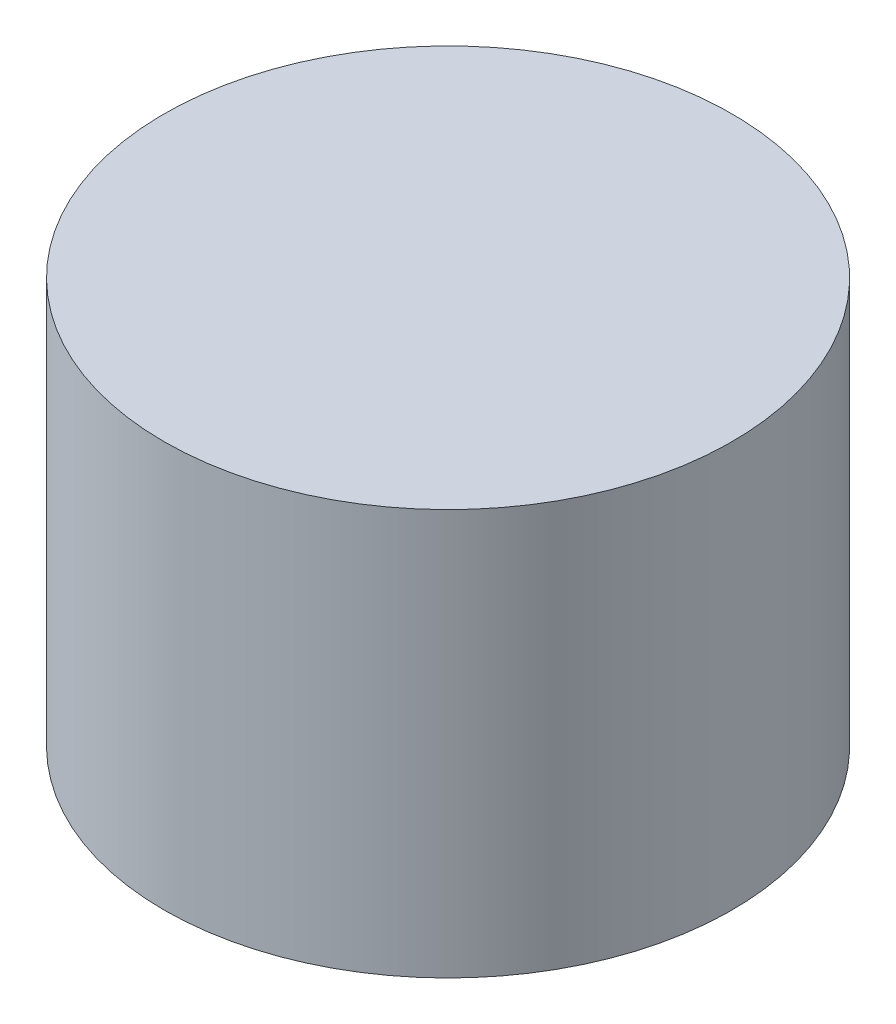
ISO-10303-21;
HEADER;
FILE_DESCRIPTION(('STEP AP214'),'2;1');
FILE_NAME('part.step','',(''),(''),'','','');
FILE_SCHEMA(('AUTOMOTIVE_DESIGN { 1 0 10303 214 1 1 1 1 }'));
ENDSEC;
DATA;
#1=APPLICATION_CONTEXT('core data for automotive mechanical design processes');
#2=APPLICATION_PROTOCOL_DEFINITION('international standard','automotive_design',2000,#1);
#3=PRODUCT_CONTEXT('',#1,'mechanical');
#4=PRODUCT('Part','Part','',(#3));
#5=PRODUCT_RELATED_PRODUCT_CATEGORY('part','',(#4));
#6=PRODUCT_DEFINITION_FORMATION('','',#4);
#7=PRODUCT_DEFINITION_CONTEXT('part definition',#1,'design');
#8=PRODUCT_DEFINITION('design','',#6,#7);
#9=PRODUCT_DEFINITION_SHAPE('','',#8);
#10=(LENGTH_UNIT() NAMED_UNIT(*) SI_UNIT(.MILLI.,.METRE.));
#11=(NAMED_UNIT(*) PLANE_ANGLE_UNIT() SI_UNIT($,.RADIAN.));
#12=(NAMED_UNIT(*) SI_UNIT($,.STERADIAN.) SOLID_ANGLE_UNIT());
#13=UNCERTAINTY_MEASURE_WITH_UNIT(LENGTH_MEASURE(1.E-05),#10,'distance_accuracy_value','');
#14=(GEOMETRIC_REPRESENTATION_CONTEXT(3) GLOBAL_UNCERTAINTY_ASSIGNED_CONTEXT((#13)) GLOBAL_UNIT_ASSIGNED_CONTEXT((#10,
#11,#12)) REPRESENTATION_CONTEXT('',''));
#15=CARTESIAN_POINT('',(0.,0.,0.));
#16=DIRECTION('',(0.,0.,1.));
#17=DIRECTION('',(1.,0.,0.));
#18=AXIS2_PLACEMENT_3D('',#15,#16,#17);
#19=CARTESIAN_POINT('',(0.,5.,0.));
#20=DIRECTION('',(0.,-1.,0.));
#21=DIRECTION('',(0.,0.,-1.));
#22=AXIS2_PLACEMENT_3D('',#19,#20,#21);
#23=CYLINDRICAL_SURFACE('',#22,3.5);
#24=CARTESIAN_POINT('',(0.,5.,0.));
#25=DIRECTION('',(0.,1.,0.));
#26=DIRECTION('',(0.,0.,1.));
#27=AXIS2_PLACEMENT_3D('',#24,#25,#26);
#28=CIRCLE('',#27,3.5);
#29=CARTESIAN_POINT('',(0.,5.,3.5));
#30=VERTEX_POINT('',#29);
#31=EDGE_CURVE('E10',#30,#30,#28,.T.);
#32=ORIENTED_EDGE('',*,*,#31,.F.);
#33=EDGE_LOOP('',(#32));
#34=FACE_BOUND('',#33,.T.);
#35=CARTESIAN_POINT('',(0.,0.,0.));
#36=DIRECTION('',(0.,1.,0.));
#37=DIRECTION('',(0.,0.,1.));
#38=AXIS2_PLACEMENT_3D('',#35,#36,#37);
#39=CIRCLE('',#38,3.5);
#40=CARTESIAN_POINT('',(0.,0.,3.5));
#41=VERTEX_POINT('',#40);
#42=EDGE_CURVE('E34',#41,#41,#39,.T.);
#43=ORIENTED_EDGE('',*,*,#42,.T.);
#44=EDGE_LOOP('',(#43));
#45=FACE_BOUND('',#44,.T.);
#46=ADVANCED_FACE('F31',(#34,#45),#23,.T.);
#47=CARTESIAN_POINT('',(0.,5.,0.));
#48=DIRECTION('',(0.,1.,0.));
#49=DIRECTION('',(0.,0.,1.));
#50=AXIS2_PLACEMENT_3D('',#47,#48,#49);
#51=PLANE('',#50);
#52=ORIENTED_EDGE('',*,*,#31,.T.);
#53=EDGE_LOOP('',(#52));
#54=FACE_BOUND('',#53,.T.);
#55=ADVANCED_FACE('F46',(#54),#51,.T.);
#56=CARTESIAN_POINT('',(0.,0.,0.));
#57=DIRECTION('',(0.,1.,0.));
#58=DIRECTION('',(0.,0.,1.));
#59=AXIS2_PLACEMENT_3D('',#56,#57,#58);
#60=PLANE('',#59);
#61=ORIENTED_EDGE('',*,*,#42,.F.);
#62=EDGE_LOOP('',(#61));
#63=FACE_BOUND('',#62,.T.);
#64=ADVANCED_FACE('F44',(#63),#60,.F.);
#65=CLOSED_SHELL('',(#46,#55,#64));
#66=MANIFOLD_SOLID_BREP('B2',#65);
#67=ADVANCED_BREP_SHAPE_REPRESENTATION('',(#18,#66),#14);
#68=SHAPE_DEFINITION_REPRESENTATION(#9,#67);
ENDSEC;
END-ISO-10303-21;
